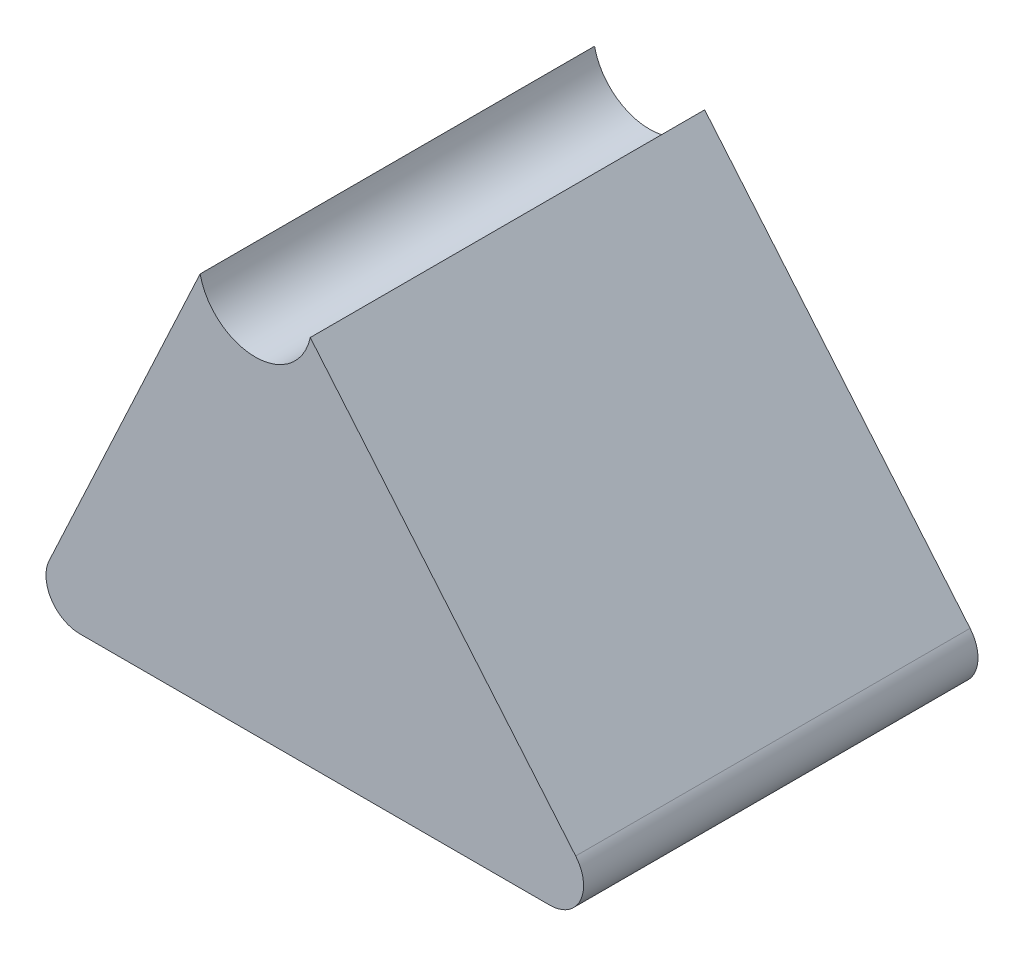
ISO-10303-21;
HEADER;
FILE_DESCRIPTION(('STEP AP214'),'2;1');
FILE_NAME('part.step','',(''),(''),'','','');
FILE_SCHEMA(('AUTOMOTIVE_DESIGN { 1 0 10303 214 1 1 1 1 }'));
ENDSEC;
DATA;
#1=APPLICATION_CONTEXT('core data for automotive mechanical design processes');
#2=APPLICATION_PROTOCOL_DEFINITION('international standard','automotive_design',2000,#1);
#3=PRODUCT_CONTEXT('',#1,'mechanical');
#4=PRODUCT('Part','Part','',(#3));
#5=PRODUCT_RELATED_PRODUCT_CATEGORY('part','',(#4));
#6=PRODUCT_DEFINITION_FORMATION('','',#4);
#7=PRODUCT_DEFINITION_CONTEXT('part definition',#1,'design');
#8=PRODUCT_DEFINITION('design','',#6,#7);
#9=PRODUCT_DEFINITION_SHAPE('','',#8);
#10=(LENGTH_UNIT() NAMED_UNIT(*) SI_UNIT(.MILLI.,.METRE.));
#11=(NAMED_UNIT(*) PLANE_ANGLE_UNIT() SI_UNIT($,.RADIAN.));
#12=(NAMED_UNIT(*) SI_UNIT($,.STERADIAN.) SOLID_ANGLE_UNIT());
#13=UNCERTAINTY_MEASURE_WITH_UNIT(LENGTH_MEASURE(1.E-05),#10,'distance_accuracy_value','');
#14=(GEOMETRIC_REPRESENTATION_CONTEXT(3) GLOBAL_UNCERTAINTY_ASSIGNED_CONTEXT((#13)) GLOBAL_UNIT_ASSIGNED_CONTEXT((#10,
#11,#12)) REPRESENTATION_CONTEXT('',''));
#15=CARTESIAN_POINT('',(0.,0.,0.));
#16=DIRECTION('',(0.,0.,1.));
#17=DIRECTION('',(1.,0.,0.));
#18=AXIS2_PLACEMENT_3D('',#15,#16,#17);
#19=CARTESIAN_POINT('',(0.,0.,35.));
#20=DIRECTION('',(0.906307787036651,-0.422618261740697,0.));
#21=DIRECTION('',(0.422618261740697,0.906307787036651,0.));
#22=AXIS2_PLACEMENT_3D('',#19,#20,#21);
#23=PLANE('',#22);
#24=DIRECTION('',(-0.422618261740697,-0.906307787036651,0.));
#25=VECTOR('',#24,1.);
#26=CARTESIAN_POINT('',(0.,0.,0.));
#27=LINE('',#26,#25);
#28=CARTESIAN_POINT('',(15.3881527191149,33.,0.));
#29=VERTEX_POINT('',#28);
#30=CARTESIAN_POINT('',(1.9901333702425,4.26785478522209,0.));
#31=VERTEX_POINT('',#30);
#32=EDGE_CURVE('E123',#29,#31,#27,.T.);
#33=ORIENTED_EDGE('',*,*,#32,.T.);
#34=DIRECTION('',(0.,0.,-1.));
#35=VECTOR('',#34,1.);
#36=CARTESIAN_POINT('',(1.99013337024251,4.26785478522209,35.));
#37=LINE('',#36,#35);
#38=CARTESIAN_POINT('',(1.9901333702425,4.26785478522209,35.));
#39=VERTEX_POINT('',#38);
#40=EDGE_CURVE('E63',#31,#39,#37,.F.);
#41=ORIENTED_EDGE('',*,*,#40,.T.);
#42=DIRECTION('',(-0.422618261740697,-0.906307787036651,0.));
#43=VECTOR('',#42,1.);
#44=CARTESIAN_POINT('',(0.,0.,35.));
#45=LINE('',#44,#43);
#46=CARTESIAN_POINT('',(15.3881527191149,33.,35.));
#47=VERTEX_POINT('',#46);
#48=EDGE_CURVE('E134',#47,#39,#45,.T.);
#49=ORIENTED_EDGE('',*,*,#48,.F.);
#50=DIRECTION('',(0.,0.,-1.));
#51=VECTOR('',#50,1.);
#52=CARTESIAN_POINT('',(15.3881527191149,33.,35.));
#53=LINE('',#52,#51);
#54=EDGE_CURVE('E113',#47,#29,#53,.T.);
#55=ORIENTED_EDGE('',*,*,#54,.T.);
#56=EDGE_LOOP('',(#33,#41,#49,#55));
#57=FACE_BOUND('',#56,.T.);
#58=ADVANCED_FACE('F39',(#57),#23,.F.);
#59=CARTESIAN_POINT('',(0.,0.,35.));
#60=DIRECTION('',(0.,1.,0.));
#61=DIRECTION('',(0.,0.,1.));
#62=AXIS2_PLACEMENT_3D('',#59,#60,#61);
#63=PLANE('',#62);
#64=DIRECTION('',(1.,0.,0.));
#65=VECTOR('',#64,1.);
#66=CARTESIAN_POINT('',(0.,0.,35.));
#67=LINE('',#66,#65);
#68=CARTESIAN_POINT('',(4.70905673135246,0.,35.));
#69=VERTEX_POINT('',#68);
#70=CARTESIAN_POINT('',(46.417929279686,0.,35.));
#71=VERTEX_POINT('',#70);
#72=EDGE_CURVE('E102',#69,#71,#67,.T.);
#73=ORIENTED_EDGE('',*,*,#72,.F.);
#74=DIRECTION('',(0.,0.,-1.));
#75=VECTOR('',#74,1.);
#76=CARTESIAN_POINT('',(4.70905673135246,0.,35.));
#77=LINE('',#76,#75);
#78=CARTESIAN_POINT('',(4.70905673135246,0.,0.));
#79=VERTEX_POINT('',#78);
#80=EDGE_CURVE('E138',#69,#79,#77,.T.);
#81=ORIENTED_EDGE('',*,*,#80,.T.);
#82=DIRECTION('',(1.,0.,0.));
#83=VECTOR('',#82,1.);
#84=CARTESIAN_POINT('',(0.,0.,0.));
#85=LINE('',#84,#83);
#86=CARTESIAN_POINT('',(46.417929279686,0.,0.));
#87=VERTEX_POINT('',#86);
#88=EDGE_CURVE('E126',#79,#87,#85,.T.);
#89=ORIENTED_EDGE('',*,*,#88,.T.);
#90=DIRECTION('',(0.,0.,-1.));
#91=VECTOR('',#90,1.);
#92=CARTESIAN_POINT('',(46.417929279686,0.,35.));
#93=LINE('',#92,#91);
#94=EDGE_CURVE('E112',#87,#71,#93,.F.);
#95=ORIENTED_EDGE('',*,*,#94,.T.);
#96=EDGE_LOOP('',(#73,#81,#89,#95));
#97=FACE_BOUND('',#96,.T.);
#98=ADVANCED_FACE('F157',(#97),#63,.F.);
#99=CARTESIAN_POINT('',(52.8514500412147,0.,35.));
#100=DIRECTION('',(-0.766044443118974,-0.642787609686544,0.));
#101=DIRECTION('',(0.642787609686544,-0.766044443118974,0.));
#102=AXIS2_PLACEMENT_3D('',#99,#100,#101);
#103=PLANE('',#102);
#104=DIRECTION('',(-0.642787609686544,0.766044443118974,0.));
#105=VECTOR('',#104,1.);
#106=CARTESIAN_POINT('',(52.8514500412147,0.,35.));
#107=LINE('',#106,#105);
#108=CARTESIAN_POINT('',(48.7160626090429,4.92836282905963,35.));
#109=VERTEX_POINT('',#108);
#110=CARTESIAN_POINT('',(25.1611622123642,33.,35.));
#111=VERTEX_POINT('',#110);
#112=EDGE_CURVE('E93',#109,#111,#107,.T.);
#113=ORIENTED_EDGE('',*,*,#112,.F.);
#114=DIRECTION('',(0.,0.,-1.));
#115=VECTOR('',#114,1.);
#116=CARTESIAN_POINT('',(48.7160626090429,4.92836282905963,35.));
#117=LINE('',#116,#115);
#118=CARTESIAN_POINT('',(48.7160626090429,4.92836282905963,0.));
#119=VERTEX_POINT('',#118);
#120=EDGE_CURVE('E11',#109,#119,#117,.T.);
#121=ORIENTED_EDGE('',*,*,#120,.T.);
#122=DIRECTION('',(-0.642787609686544,0.766044443118974,0.));
#123=VECTOR('',#122,1.);
#124=CARTESIAN_POINT('',(52.8514500412147,0.,0.));
#125=LINE('',#124,#123);
#126=CARTESIAN_POINT('',(25.1611622123642,33.,0.));
#127=VERTEX_POINT('',#126);
#128=EDGE_CURVE('E108',#119,#127,#125,.T.);
#129=ORIENTED_EDGE('',*,*,#128,.T.);
#130=DIRECTION('',(0.,0.,-1.));
#131=VECTOR('',#130,1.);
#132=CARTESIAN_POINT('',(25.1611622123642,33.,35.));
#133=LINE('',#132,#131);
#134=EDGE_CURVE('E105',#111,#127,#133,.T.);
#135=ORIENTED_EDGE('',*,*,#134,.F.);
#136=EDGE_LOOP('',(#113,#121,#129,#135));
#137=FACE_BOUND('',#136,.T.);
#138=ADVANCED_FACE('F106',(#137),#103,.F.);
#139=CARTESIAN_POINT('',(20.2746574657395,34.0592786985561,35.));
#140=DIRECTION('',(0.,0.,-1.));
#141=DIRECTION('',(-1.,0.,0.));
#142=AXIS2_PLACEMENT_3D('',#139,#140,#141);
#143=CYLINDRICAL_SURFACE('',#142,5.);
#144=CARTESIAN_POINT('',(20.2746574657395,34.0592786985561,0.));
#145=DIRECTION('',(0.,0.,-1.));
#146=DIRECTION('',(-1.,0.,0.));
#147=AXIS2_PLACEMENT_3D('',#144,#145,#146);
#148=CIRCLE('',#147,5.);
#149=EDGE_CURVE('E132',#127,#29,#148,.T.);
#150=ORIENTED_EDGE('',*,*,#149,.T.);
#151=ORIENTED_EDGE('',*,*,#54,.F.);
#152=CARTESIAN_POINT('',(20.2746574657395,34.0592786985561,35.));
#153=DIRECTION('',(0.,0.,-1.));
#154=DIRECTION('',(-1.,0.,0.));
#155=AXIS2_PLACEMENT_3D('',#152,#153,#154);
#156=CIRCLE('',#155,5.);
#157=EDGE_CURVE('E97',#111,#47,#156,.T.);
#158=ORIENTED_EDGE('',*,*,#157,.F.);
#159=ORIENTED_EDGE('',*,*,#134,.T.);
#160=EDGE_LOOP('',(#150,#151,#158,#159));
#161=FACE_BOUND('',#160,.T.);
#162=ADVANCED_FACE('F115',(#161),#143,.F.);
#163=CARTESIAN_POINT('',(20.2746574657395,34.0592786985561,35.));
#164=DIRECTION('',(0.,0.,-1.));
#165=DIRECTION('',(-1.,0.,0.));
#166=AXIS2_PLACEMENT_3D('',#163,#164,#165);
#167=PLANE('',#166);
#168=ORIENTED_EDGE('',*,*,#48,.T.);
#169=CARTESIAN_POINT('',(4.70905673135246,3.,35.));
#170=DIRECTION('',(0.,0.,-1.));
#171=DIRECTION('',(-1.,0.,0.));
#172=AXIS2_PLACEMENT_3D('',#169,#170,#171);
#173=CIRCLE('',#172,3.);
#174=EDGE_CURVE('E48',#39,#69,#173,.F.);
#175=ORIENTED_EDGE('',*,*,#174,.T.);
#176=ORIENTED_EDGE('',*,*,#72,.T.);
#177=CARTESIAN_POINT('',(46.417929279686,3.,35.));
#178=DIRECTION('',(0.,0.,-1.));
#179=DIRECTION('',(-1.,0.,0.));
#180=AXIS2_PLACEMENT_3D('',#177,#178,#179);
#181=CIRCLE('',#180,3.);
#182=EDGE_CURVE('E55',#71,#109,#181,.F.);
#183=ORIENTED_EDGE('',*,*,#182,.T.);
#184=ORIENTED_EDGE('',*,*,#112,.T.);
#185=ORIENTED_EDGE('',*,*,#157,.T.);
#186=EDGE_LOOP('',(#168,#175,#176,#183,#184,#185));
#187=FACE_BOUND('',#186,.T.);
#188=ADVANCED_FACE('F95',(#187),#167,.F.);
#189=CARTESIAN_POINT('',(20.2746574657395,34.0592786985561,0.));
#190=DIRECTION('',(0.,0.,-1.));
#191=DIRECTION('',(-1.,0.,0.));
#192=AXIS2_PLACEMENT_3D('',#189,#190,#191);
#193=PLANE('',#192);
#194=ORIENTED_EDGE('',*,*,#88,.F.);
#195=CARTESIAN_POINT('',(4.70905673135246,3.,0.));
#196=DIRECTION('',(0.,0.,-1.));
#197=DIRECTION('',(-1.,0.,0.));
#198=AXIS2_PLACEMENT_3D('',#195,#196,#197);
#199=CIRCLE('',#198,3.);
#200=EDGE_CURVE('E145',#79,#31,#199,.T.);
#201=ORIENTED_EDGE('',*,*,#200,.T.);
#202=ORIENTED_EDGE('',*,*,#32,.F.);
#203=ORIENTED_EDGE('',*,*,#149,.F.);
#204=ORIENTED_EDGE('',*,*,#128,.F.);
#205=CARTESIAN_POINT('',(46.417929279686,3.,0.));
#206=DIRECTION('',(0.,0.,-1.));
#207=DIRECTION('',(-1.,0.,0.));
#208=AXIS2_PLACEMENT_3D('',#205,#206,#207);
#209=CIRCLE('',#208,3.);
#210=EDGE_CURVE('E142',#119,#87,#209,.T.);
#211=ORIENTED_EDGE('',*,*,#210,.T.);
#212=EDGE_LOOP('',(#194,#201,#202,#203,#204,#211));
#213=FACE_BOUND('',#212,.T.);
#214=ADVANCED_FACE('F164',(#213),#193,.T.);
#215=CARTESIAN_POINT('',(4.70905673135246,3.,35.));
#216=DIRECTION('',(0.,0.,-1.));
#217=DIRECTION('',(-1.,0.,0.));
#218=AXIS2_PLACEMENT_3D('',#215,#216,#217);
#219=CYLINDRICAL_SURFACE('',#218,3.);
#220=ORIENTED_EDGE('',*,*,#174,.F.);
#221=ORIENTED_EDGE('',*,*,#40,.F.);
#222=ORIENTED_EDGE('',*,*,#200,.F.);
#223=ORIENTED_EDGE('',*,*,#80,.F.);
#224=EDGE_LOOP('',(#220,#221,#222,#223));
#225=FACE_BOUND('',#224,.T.);
#226=ADVANCED_FACE('F161',(#225),#219,.T.);
#227=CARTESIAN_POINT('',(46.417929279686,3.,35.));
#228=DIRECTION('',(0.,0.,-1.));
#229=DIRECTION('',(-1.,0.,0.));
#230=AXIS2_PLACEMENT_3D('',#227,#228,#229);
#231=CYLINDRICAL_SURFACE('',#230,3.);
#232=ORIENTED_EDGE('',*,*,#182,.F.);
#233=ORIENTED_EDGE('',*,*,#94,.F.);
#234=ORIENTED_EDGE('',*,*,#210,.F.);
#235=ORIENTED_EDGE('',*,*,#120,.F.);
#236=EDGE_LOOP('',(#232,#233,#234,#235));
#237=FACE_BOUND('',#236,.T.);
#238=ADVANCED_FACE('F41',(#237),#231,.T.);
#239=CLOSED_SHELL('',(#58,#98,#138,#162,#188,#214,#226,#238));
#240=MANIFOLD_SOLID_BREP('B2',#239);
#241=ADVANCED_BREP_SHAPE_REPRESENTATION('',(#18,#240),#14);
#242=SHAPE_DEFINITION_REPRESENTATION(#9,#241);
ENDSEC;
END-ISO-10303-21;
